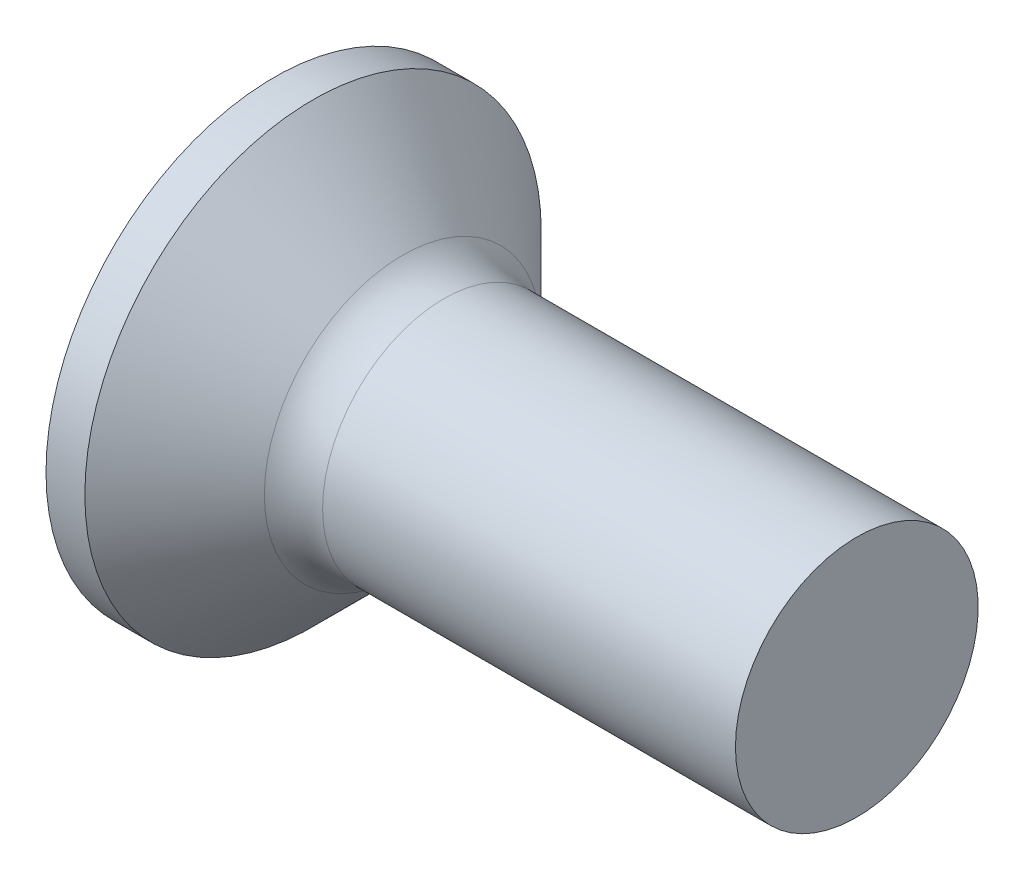
ISO-10303-21;
HEADER;
FILE_DESCRIPTION(('STEP AP214'),'2;1');
FILE_NAME('part.step','',(''),(''),'','','');
FILE_SCHEMA(('AUTOMOTIVE_DESIGN { 1 0 10303 214 1 1 1 1 }'));
ENDSEC;
DATA;
#1=APPLICATION_CONTEXT('core data for automotive mechanical design processes');
#2=APPLICATION_PROTOCOL_DEFINITION('international standard','automotive_design',2000,#1);
#3=PRODUCT_CONTEXT('',#1,'mechanical');
#4=PRODUCT('Part','Part','',(#3));
#5=PRODUCT_RELATED_PRODUCT_CATEGORY('part','',(#4));
#6=PRODUCT_DEFINITION_FORMATION('','',#4);
#7=PRODUCT_DEFINITION_CONTEXT('part definition',#1,'design');
#8=PRODUCT_DEFINITION('design','',#6,#7);
#9=PRODUCT_DEFINITION_SHAPE('','',#8);
#10=(LENGTH_UNIT() NAMED_UNIT(*) SI_UNIT(.MILLI.,.METRE.));
#11=(NAMED_UNIT(*) PLANE_ANGLE_UNIT() SI_UNIT($,.RADIAN.));
#12=(NAMED_UNIT(*) SI_UNIT($,.STERADIAN.) SOLID_ANGLE_UNIT());
#13=UNCERTAINTY_MEASURE_WITH_UNIT(LENGTH_MEASURE(1.E-05),#10,'distance_accuracy_value','');
#14=(GEOMETRIC_REPRESENTATION_CONTEXT(3) GLOBAL_UNCERTAINTY_ASSIGNED_CONTEXT((#13)) GLOBAL_UNIT_ASSIGNED_CONTEXT((#10,
#11,#12)) REPRESENTATION_CONTEXT('',''));
#15=CARTESIAN_POINT('',(0.,0.,0.));
#16=DIRECTION('',(0.,0.,1.));
#17=DIRECTION('',(1.,0.,0.));
#18=AXIS2_PLACEMENT_3D('',#15,#16,#17);
#19=CARTESIAN_POINT('',(1.73,0.370000000000002,-0.537453847829801));
#20=DIRECTION('',(-0.446197800778958,0.,0.89493436774996));
#21=DIRECTION('',(0.89493436774996,0.,0.446197800778958));
#22=AXIS2_PLACEMENT_3D('',#19,#20,#21);
#23=PLANE('',#22);
#24=DIRECTION('',(0.,1.,0.));
#25=VECTOR('',#24,1.);
#26=CARTESIAN_POINT('',(0.,0.370000000000002,-1.4));
#27=LINE('',#26,#25);
#28=CARTESIAN_POINT('',(0.,0.370000000000005,-1.4));
#29=VERTEX_POINT('',#28);
#30=CARTESIAN_POINT('',(0.,-0.369999999999996,-1.4));
#31=VERTEX_POINT('',#30);
#32=EDGE_CURVE('E175',#29,#31,#27,.F.);
#33=ORIENTED_EDGE('',*,*,#32,.T.);
#34=DIRECTION('',(-0.89493436774996,0.,-0.446197800778958));
#35=VECTOR('',#34,1.);
#36=CARTESIAN_POINT('',(1.73,-0.369999999999998,-0.537453847829803));
#37=LINE('',#36,#35);
#38=CARTESIAN_POINT('',(1.73,-0.369999999999997,-0.537453847829803));
#39=VERTEX_POINT('',#38);
#40=EDGE_CURVE('E203',#39,#31,#37,.T.);
#41=ORIENTED_EDGE('',*,*,#40,.F.);
#42=DIRECTION('',(0.,1.,0.));
#43=VECTOR('',#42,1.);
#44=CARTESIAN_POINT('',(1.73,0.370000000000002,-0.537453847829801));
#45=LINE('',#44,#43);
#46=CARTESIAN_POINT('',(1.73,-0.142405622961569,-0.537453847829803));
#47=VERTEX_POINT('',#46);
#48=EDGE_CURVE('E186',#39,#47,#45,.T.);
#49=ORIENTED_EDGE('',*,*,#48,.T.);
#50=CARTESIAN_POINT('',(2.67005364887817,0.,-0.0687604040879396));
#51=DIRECTION('',(-0.446197800778958,0.,0.89493436774996));
#52=DIRECTION('',(-0.89493436774996,0.,-0.446197800778958));
#53=AXIS2_PLACEMENT_3D('',#50,#51,#52);
#54=ELLIPSE('',#53,1.09876168000609,0.485419222295071);
#55=CARTESIAN_POINT('',(1.73,0.142405622961573,-0.537453847829802));
#56=VERTEX_POINT('',#55);
#57=EDGE_CURVE('E20',#47,#56,#54,.F.);
#58=ORIENTED_EDGE('',*,*,#57,.T.);
#59=DIRECTION('',(0.,1.,0.));
#60=VECTOR('',#59,1.);
#61=CARTESIAN_POINT('',(1.73,0.370000000000002,-0.537453847829801));
#62=LINE('',#61,#60);
#63=CARTESIAN_POINT('',(1.73,0.370000000000002,-0.537453847829801));
#64=VERTEX_POINT('',#63);
#65=EDGE_CURVE('E167',#56,#64,#62,.T.);
#66=ORIENTED_EDGE('',*,*,#65,.T.);
#67=DIRECTION('',(0.89493436774996,0.,0.446197800778958));
#68=VECTOR('',#67,1.);
#69=CARTESIAN_POINT('',(0.,0.370000000000005,-1.4));
#70=LINE('',#69,#68);
#71=EDGE_CURVE('E193',#29,#64,#70,.T.);
#72=ORIENTED_EDGE('',*,*,#71,.F.);
#73=EDGE_LOOP('',(#33,#41,#49,#58,#66,#72));
#74=FACE_BOUND('',#73,.T.);
#75=ADVANCED_FACE('F17',(#74),#23,.T.);
#76=CARTESIAN_POINT('',(1.73,-0.369999999999998,-0.537453847829803));
#77=DIRECTION('',(0.,1.,0.));
#78=DIRECTION('',(0.,0.,1.));
#79=AXIS2_PLACEMENT_3D('',#76,#77,#78);
#80=PLANE('',#79);
#81=DIRECTION('',(0.,0.,1.));
#82=VECTOR('',#81,1.);
#83=CARTESIAN_POINT('',(1.73,-0.369999999999998,-0.537453847829803));
#84=LINE('',#83,#82);
#85=CARTESIAN_POINT('',(1.73000000000456,-0.369999999999999,-0.415013252797763));
#86=VERTEX_POINT('',#85);
#87=EDGE_CURVE('E206',#86,#39,#84,.F.);
#88=ORIENTED_EDGE('',*,*,#87,.T.);
#89=ORIENTED_EDGE('',*,*,#40,.T.);
#90=DIRECTION('',(0.,0.,1.));
#91=VECTOR('',#90,1.);
#92=CARTESIAN_POINT('',(0.,-0.369999999999998,-0.537453847829803));
#93=LINE('',#92,#91);
#94=CARTESIAN_POINT('',(0.,-0.369999999999998,-0.566915305441009));
#95=VERTEX_POINT('',#94);
#96=EDGE_CURVE('E200',#31,#95,#93,.T.);
#97=ORIENTED_EDGE('',*,*,#96,.T.);
#98=CARTESIAN_POINT('',(1.15518839060341E-13,-0.369999999999998,-0.566915305441));
#99=CARTESIAN_POINT('',(0.2102117982196,-0.369999999999998,-0.549344413469358));
#100=CARTESIAN_POINT('',(0.420407070773422,-0.369999999999998,-0.531564435256427));
#101=CARTESIAN_POINT('',(0.840738581494577,-0.369999999999998,-0.495346236697712));
#102=CARTESIAN_POINT('',(1.05087482025002,-0.369999999999998,-0.476908023162054));
#103=CARTESIAN_POINT('',(1.33915479954322,-0.369999999999998,-0.45099175681714));
#104=CARTESIAN_POINT('',(1.41733328844347,-0.369999999999999,-0.443900811020496));
#105=CARTESIAN_POINT('',(1.57367713349997,-0.369999999999999,-0.429572412867441));
#106=CARTESIAN_POINT('',(1.65184248960491,-0.369999999999999,-0.422334959951629));
#107=CARTESIAN_POINT('',(1.73000000000269,-0.369999999999999,-0.41501325279576));
#108=B_SPLINE_CURVE_WITH_KNOTS('',3,(#98,#99,#100,#101,#102,#103,#104,#105,#106,#107),
.UNSPECIFIED.,.F.,.F.,(4,2,2,2,4),(0.,0.632836027833726,1.26566551022003,1.5011636151346,
1.73666261941034),.UNSPECIFIED.);
#109=EDGE_CURVE('E444',#95,#86,#108,.T.);
#110=ORIENTED_EDGE('',*,*,#109,.T.);
#111=EDGE_LOOP('',(#88,#89,#97,#110));
#112=FACE_BOUND('',#111,.T.);
#113=ADVANCED_FACE('F462',(#112),#80,.T.);
#114=CARTESIAN_POINT('',(1.73,0.369999999999998,0.537453847829803));
#115=DIRECTION('',(0.,-1.,0.));
#116=DIRECTION('',(0.,0.,-1.));
#117=AXIS2_PLACEMENT_3D('',#114,#115,#116);
#118=PLANE('',#117);
#119=DIRECTION('',(0.,0.,-1.));
#120=VECTOR('',#119,1.);
#121=CARTESIAN_POINT('',(0.,0.369999999999998,0.537453847829803));
#122=LINE('',#121,#120);
#123=CARTESIAN_POINT('',(0.,0.370000000000002,-0.566915305441002));
#124=VERTEX_POINT('',#123);
#125=EDGE_CURVE('E196',#124,#29,#122,.T.);
#126=ORIENTED_EDGE('',*,*,#125,.T.);
#127=ORIENTED_EDGE('',*,*,#71,.T.);
#128=DIRECTION('',(0.,0.,-1.));
#129=VECTOR('',#128,1.);
#130=CARTESIAN_POINT('',(1.73,0.369999999999998,0.537453847829803));
#131=LINE('',#130,#129);
#132=CARTESIAN_POINT('',(1.73000000000456,0.370000000000001,-0.41501325279776));
#133=VERTEX_POINT('',#132);
#134=EDGE_CURVE('E171',#64,#133,#131,.F.);
#135=ORIENTED_EDGE('',*,*,#134,.T.);
#136=CARTESIAN_POINT('',(1.73000000000269,0.370000000000001,-0.415013252795685));
#137=CARTESIAN_POINT('',(1.5575031296645,0.370000000000001,-0.43115840306127));
#138=CARTESIAN_POINT('',(1.384970964837,0.370000000000001,-0.446919624104935));
#139=CARTESIAN_POINT('',(1.03985338162105,0.370000000000002,-0.477835186695482));
#140=CARTESIAN_POINT('',(0.867267963610062,0.370000000000002,-0.492989532448679));
#141=CARTESIAN_POINT('',(0.578901935112579,0.370000000000002,-0.517935214751777));
#142=CARTESIAN_POINT('',(0.463131863682273,0.370000000000002,-0.527849157289397));
#143=CARTESIAN_POINT('',(0.231576539330875,0.370000000000002,-0.547504590054716));
#144=CARTESIAN_POINT('',(0.115791286342449,0.370000000000002,-0.557246079489565));
#145=CARTESIAN_POINT('',(1.17860762946342E-13,0.370000000000002,-0.566915305441023));
#146=B_SPLINE_CURVE_WITH_KNOTS('',3,(#136,#137,#138,#139,#140,#141,#142,#143,#144,#145),
.UNSPECIFIED.,.F.,.F.,(4,2,2,2,4),(0.,0.51975104195004,1.03949848082865,1.38807974305796,
1.73666260746855),.UNSPECIFIED.);
#147=EDGE_CURVE('E441',#133,#124,#146,.T.);
#148=ORIENTED_EDGE('',*,*,#147,.T.);
#149=EDGE_LOOP('',(#126,#127,#135,#148));
#150=FACE_BOUND('',#149,.T.);
#151=ADVANCED_FACE('F483',(#150),#118,.T.);
#152=CARTESIAN_POINT('',(0.,0.,0.));
#153=DIRECTION('',(-1.,0.,0.));
#154=DIRECTION('',(0.,0.,1.));
#155=AXIS2_PLACEMENT_3D('',#152,#153,#154);
#156=CONICAL_SURFACE('',#155,0.676973384663881,0.0698131700826303);
#157=ORIENTED_EDGE('',*,*,#109,.F.);
#158=CARTESIAN_POINT('',(0.,0.,0.));
#159=DIRECTION('',(-1.,0.,0.));
#160=DIRECTION('',(0.,0.,1.));
#161=AXIS2_PLACEMENT_3D('',#158,#159,#160);
#162=CIRCLE('',#161,0.676973384663881);
#163=CARTESIAN_POINT('',(0.,-0.566915305441008,-0.37));
#164=VERTEX_POINT('',#163);
#165=EDGE_CURVE('E195',#164,#95,#162,.F.);
#166=ORIENTED_EDGE('',*,*,#165,.F.);
#167=CARTESIAN_POINT('',(1.73000000000114,-0.415013252795832,-0.37));
#168=CARTESIAN_POINT('',(1.55750312966291,-0.431158403061417,-0.37));
#169=CARTESIAN_POINT('',(1.38497096483538,-0.446919624105083,-0.37));
#170=CARTESIAN_POINT('',(1.03985338161936,-0.477835186695632,-0.37));
#171=CARTESIAN_POINT('',(0.86726796360834,-0.49298953244883,-0.37));
#172=CARTESIAN_POINT('',(0.57890193511112,-0.517935214751904,-0.37));
#173=CARTESIAN_POINT('',(0.463131863681111,-0.527849157289497,-0.37));
#174=CARTESIAN_POINT('',(0.231576539330305,-0.547504590054765,-0.37));
#175=CARTESIAN_POINT('',(0.115791286342175,-0.557246079489589,-0.37));
#176=CARTESIAN_POINT('',(1.4020293900195E-13,-0.566915305441022,-0.37));
#177=B_SPLINE_CURVE_WITH_KNOTS('',3,(#167,#168,#169,#170,#171,#172,#173,#174,#175,#176),
.UNSPECIFIED.,.F.,.F.,(4,2,2,2,4),(0.,0.519751041950141,1.03949848082886,1.38807974305727,
1.73666260746697),.UNSPECIFIED.);
#178=CARTESIAN_POINT('',(1.73000000000456,-0.415013252797762,-0.37));
#179=VERTEX_POINT('',#178);
#180=EDGE_CURVE('E431',#179,#164,#177,.T.);
#181=ORIENTED_EDGE('',*,*,#180,.F.);
#182=CARTESIAN_POINT('',(1.73000000000911,0.,0.));
#183=DIRECTION('',(-1.,0.,0.));
#184=DIRECTION('',(0.,0.,1.));
#185=AXIS2_PLACEMENT_3D('',#182,#183,#184);
#186=CIRCLE('',#185,0.555999999996004);
#187=EDGE_CURVE('E442',#86,#179,#186,.T.);
#188=ORIENTED_EDGE('',*,*,#187,.F.);
#189=EDGE_LOOP('',(#157,#166,#181,#188));
#190=FACE_BOUND('',#189,.T.);
#191=ADVANCED_FACE('F465',(#190),#156,.F.);
#192=CARTESIAN_POINT('',(0.,0.,0.));
#193=DIRECTION('',(-1.,0.,0.));
#194=DIRECTION('',(0.,0.,1.));
#195=AXIS2_PLACEMENT_3D('',#192,#193,#194);
#196=CONICAL_SURFACE('',#195,0.676973384663881,0.0698131700826303);
#197=ORIENTED_EDGE('',*,*,#147,.F.);
#198=CARTESIAN_POINT('',(1.73000000000911,0.,0.));
#199=DIRECTION('',(-1.,0.,0.));
#200=DIRECTION('',(0.,0.,1.));
#201=AXIS2_PLACEMENT_3D('',#198,#199,#200);
#202=CIRCLE('',#201,0.555999999996004);
#203=CARTESIAN_POINT('',(1.73000000000456,0.415013252797762,-0.37));
#204=VERTEX_POINT('',#203);
#205=EDGE_CURVE('E179',#204,#133,#202,.T.);
#206=ORIENTED_EDGE('',*,*,#205,.F.);
#207=CARTESIAN_POINT('',(1.38054906288361E-13,0.566915305440997,-0.37));
#208=CARTESIAN_POINT('',(0.210211798219623,0.549344413469355,-0.37));
#209=CARTESIAN_POINT('',(0.420407070773443,0.531564435256424,-0.37));
#210=CARTESIAN_POINT('',(0.840738581494597,0.495346236697709,-0.37));
#211=CARTESIAN_POINT('',(1.05087482025004,0.476908023162051,-0.37));
#212=CARTESIAN_POINT('',(1.33915479954298,0.450991756817161,-0.37));
#213=CARTESIAN_POINT('',(1.41733328844297,0.443900811020541,-0.37));
#214=CARTESIAN_POINT('',(1.57367713349894,0.429572412867535,-0.37));
#215=CARTESIAN_POINT('',(1.65184248960362,0.422334959951747,-0.37));
#216=CARTESIAN_POINT('',(1.73000000000114,0.415013252795904,-0.37));
#217=B_SPLINE_CURVE_WITH_KNOTS('',3,(#207,#208,#209,#210,#211,#212,#213,#214,#215,#216),
.UNSPECIFIED.,.F.,.F.,(4,2,2,2,4),(0.,0.632836027833724,1.26566551022003,1.5011636151338,
1.73666261940875),.UNSPECIFIED.);
#218=CARTESIAN_POINT('',(0.,0.566915305441003,-0.37));
#219=VERTEX_POINT('',#218);
#220=EDGE_CURVE('E421',#219,#204,#217,.T.);
#221=ORIENTED_EDGE('',*,*,#220,.F.);
#222=CARTESIAN_POINT('',(0.,0.,0.));
#223=DIRECTION('',(-1.,0.,0.));
#224=DIRECTION('',(0.,0.,1.));
#225=AXIS2_PLACEMENT_3D('',#222,#223,#224);
#226=CIRCLE('',#225,0.676973384663881);
#227=EDGE_CURVE('E437',#124,#219,#226,.F.);
#228=ORIENTED_EDGE('',*,*,#227,.F.);
#229=EDGE_LOOP('',(#197,#206,#221,#228));
#230=FACE_BOUND('',#229,.T.);
#231=ADVANCED_FACE('F490',(#230),#196,.F.);
#232=CARTESIAN_POINT('',(1.73,0.537453847829802,-0.37));
#233=DIRECTION('',(0.,0.,1.));
#234=DIRECTION('',(1.,0.,0.));
#235=AXIS2_PLACEMENT_3D('',#232,#233,#234);
#236=PLANE('',#235);
#237=DIRECTION('',(0.,1.,0.));
#238=VECTOR('',#237,1.);
#239=CARTESIAN_POINT('',(0.,0.537453847829802,-0.37));
#240=LINE('',#239,#238);
#241=CARTESIAN_POINT('',(0.,-1.4,-0.37));
#242=VERTEX_POINT('',#241);
#243=EDGE_CURVE('E427',#164,#242,#240,.F.);
#244=ORIENTED_EDGE('',*,*,#243,.T.);
#245=DIRECTION('',(-0.89493436774996,-0.446197800778958,0.));
#246=VECTOR('',#245,1.);
#247=CARTESIAN_POINT('',(1.73,-0.537453847829802,-0.37));
#248=LINE('',#247,#246);
#249=CARTESIAN_POINT('',(1.73,-0.537453847829802,-0.37));
#250=VERTEX_POINT('',#249);
#251=EDGE_CURVE('E408',#250,#242,#248,.T.);
#252=ORIENTED_EDGE('',*,*,#251,.F.);
#253=DIRECTION('',(0.,1.,0.));
#254=VECTOR('',#253,1.);
#255=CARTESIAN_POINT('',(1.73,0.537453847829802,-0.37));
#256=LINE('',#255,#254);
#257=EDGE_CURVE('E434',#250,#179,#256,.T.);
#258=ORIENTED_EDGE('',*,*,#257,.T.);
#259=ORIENTED_EDGE('',*,*,#180,.T.);
#260=EDGE_LOOP('',(#244,#252,#258,#259));
#261=FACE_BOUND('',#260,.T.);
#262=ADVANCED_FACE('F532',(#261),#236,.T.);
#263=CARTESIAN_POINT('',(1.73,0.537453847829802,-0.37));
#264=DIRECTION('',(0.,0.,1.));
#265=DIRECTION('',(1.,0.,0.));
#266=AXIS2_PLACEMENT_3D('',#263,#264,#265);
#267=PLANE('',#266);
#268=DIRECTION('',(0.,1.,0.));
#269=VECTOR('',#268,1.);
#270=CARTESIAN_POINT('',(1.73,0.537453847829802,-0.37));
#271=LINE('',#270,#269);
#272=CARTESIAN_POINT('',(1.73,0.537453847829802,-0.37));
#273=VERTEX_POINT('',#272);
#274=EDGE_CURVE('E413',#204,#273,#271,.T.);
#275=ORIENTED_EDGE('',*,*,#274,.T.);
#276=DIRECTION('',(0.89493436774996,-0.446197800778958,0.));
#277=VECTOR('',#276,1.);
#278=CARTESIAN_POINT('',(1.73,0.537453847829802,-0.37));
#279=LINE('',#278,#277);
#280=CARTESIAN_POINT('',(0.,1.4,-0.37));
#281=VERTEX_POINT('',#280);
#282=EDGE_CURVE('E389',#281,#273,#279,.T.);
#283=ORIENTED_EDGE('',*,*,#282,.F.);
#284=DIRECTION('',(0.,1.,0.));
#285=VECTOR('',#284,1.);
#286=CARTESIAN_POINT('',(0.,0.537453847829802,-0.37));
#287=LINE('',#286,#285);
#288=EDGE_CURVE('E424',#281,#219,#287,.F.);
#289=ORIENTED_EDGE('',*,*,#288,.T.);
#290=ORIENTED_EDGE('',*,*,#220,.T.);
#291=EDGE_LOOP('',(#275,#283,#289,#290));
#292=FACE_BOUND('',#291,.T.);
#293=ADVANCED_FACE('F527',(#292),#267,.T.);
#294=CARTESIAN_POINT('',(1.73,-0.537453847829802,-0.37));
#295=DIRECTION('',(-0.446197800778958,0.89493436774996,0.));
#296=DIRECTION('',(-0.89493436774996,-0.446197800778958,0.));
#297=AXIS2_PLACEMENT_3D('',#294,#295,#296);
#298=PLANE('',#297);
#299=DIRECTION('',(0.,0.,1.));
#300=VECTOR('',#299,1.);
#301=CARTESIAN_POINT('',(0.,-1.4,-0.37));
#302=LINE('',#301,#300);
#303=CARTESIAN_POINT('',(0.,-1.4,0.37));
#304=VERTEX_POINT('',#303);
#305=EDGE_CURVE('E399',#242,#304,#302,.T.);
#306=ORIENTED_EDGE('',*,*,#305,.T.);
#307=DIRECTION('',(-0.89493436774996,-0.446197800778958,0.));
#308=VECTOR('',#307,1.);
#309=CARTESIAN_POINT('',(1.73,-0.537453847829802,0.37));
#310=LINE('',#309,#308);
#311=CARTESIAN_POINT('',(1.73,-0.537453847829802,0.37));
#312=VERTEX_POINT('',#311);
#313=EDGE_CURVE('E349',#312,#304,#310,.T.);
#314=ORIENTED_EDGE('',*,*,#313,.F.);
#315=DIRECTION('',(0.,0.,-1.));
#316=VECTOR('',#315,1.);
#317=CARTESIAN_POINT('',(1.73,-0.537453847829802,-0.37));
#318=LINE('',#317,#316);
#319=CARTESIAN_POINT('',(1.73,-0.537453847829802,0.142405622961571));
#320=VERTEX_POINT('',#319);
#321=EDGE_CURVE('E374',#312,#320,#318,.T.);
#322=ORIENTED_EDGE('',*,*,#321,.T.);
#323=CARTESIAN_POINT('',(2.67005364887817,-0.0687604040879396,0.));
#324=DIRECTION('',(-0.446197800778958,0.89493436774996,0.));
#325=DIRECTION('',(-0.89493436774996,-0.446197800778958,0.));
#326=AXIS2_PLACEMENT_3D('',#323,#324,#325);
#327=ELLIPSE('',#326,1.09876168000609,0.485419222295071);
#328=CARTESIAN_POINT('',(1.73,-0.537453847829802,-0.14240562296157));
#329=VERTEX_POINT('',#328);
#330=EDGE_CURVE('E366',#320,#329,#327,.F.);
#331=ORIENTED_EDGE('',*,*,#330,.T.);
#332=DIRECTION('',(0.,0.,-1.));
#333=VECTOR('',#332,1.);
#334=CARTESIAN_POINT('',(1.73,-0.537453847829802,-0.37));
#335=LINE('',#334,#333);
#336=EDGE_CURVE('E359',#329,#250,#335,.T.);
#337=ORIENTED_EDGE('',*,*,#336,.T.);
#338=ORIENTED_EDGE('',*,*,#251,.T.);
#339=EDGE_LOOP('',(#306,#314,#322,#331,#337,#338));
#340=FACE_BOUND('',#339,.T.);
#341=ADVANCED_FACE('F531',(#340),#298,.T.);
#342=CARTESIAN_POINT('',(1.73,0.537453847829802,0.37));
#343=DIRECTION('',(-0.446197800778958,-0.89493436774996,0.));
#344=DIRECTION('',(0.89493436774996,-0.446197800778958,0.));
#345=AXIS2_PLACEMENT_3D('',#342,#343,#344);
#346=PLANE('',#345);
#347=DIRECTION('',(0.,0.,1.));
#348=VECTOR('',#347,1.);
#349=CARTESIAN_POINT('',(0.,1.4,0.37));
#350=LINE('',#349,#348);
#351=CARTESIAN_POINT('',(0.,1.4,0.37));
#352=VERTEX_POINT('',#351);
#353=EDGE_CURVE('E396',#352,#281,#350,.F.);
#354=ORIENTED_EDGE('',*,*,#353,.T.);
#355=ORIENTED_EDGE('',*,*,#282,.T.);
#356=DIRECTION('',(0.,0.,-1.));
#357=VECTOR('',#356,1.);
#358=CARTESIAN_POINT('',(1.73,0.537453847829802,-0.37));
#359=LINE('',#358,#357);
#360=CARTESIAN_POINT('',(1.73,0.537453847829802,-0.142405622961572));
#361=VERTEX_POINT('',#360);
#362=EDGE_CURVE('E387',#273,#361,#359,.F.);
#363=ORIENTED_EDGE('',*,*,#362,.T.);
#364=CARTESIAN_POINT('',(2.67005364887817,0.06876040408794,0.));
#365=DIRECTION('',(-0.446197800778958,-0.89493436774996,0.));
#366=DIRECTION('',(-0.89493436774996,0.446197800778958,0.));
#367=AXIS2_PLACEMENT_3D('',#364,#365,#366);
#368=ELLIPSE('',#367,1.09876168000609,0.485419222295071);
#369=CARTESIAN_POINT('',(1.73,0.537453847829802,0.142405622961571));
#370=VERTEX_POINT('',#369);
#371=EDGE_CURVE('E380',#361,#370,#368,.F.);
#372=ORIENTED_EDGE('',*,*,#371,.T.);
#373=DIRECTION('',(0.,0.,-1.));
#374=VECTOR('',#373,1.);
#375=CARTESIAN_POINT('',(1.73,0.537453847829802,-0.37));
#376=LINE('',#375,#374);
#377=CARTESIAN_POINT('',(1.73,0.537453847829802,0.37));
#378=VERTEX_POINT('',#377);
#379=EDGE_CURVE('E376',#370,#378,#376,.F.);
#380=ORIENTED_EDGE('',*,*,#379,.T.);
#381=DIRECTION('',(0.89493436774996,-0.446197800778958,0.));
#382=VECTOR('',#381,1.);
#383=CARTESIAN_POINT('',(0.,1.4,0.37));
#384=LINE('',#383,#382);
#385=EDGE_CURVE('E181',#352,#378,#384,.T.);
#386=ORIENTED_EDGE('',*,*,#385,.F.);
#387=EDGE_LOOP('',(#354,#355,#363,#372,#380,#386));
#388=FACE_BOUND('',#387,.T.);
#389=ADVANCED_FACE('F583',(#388),#346,.T.);
#390=CARTESIAN_POINT('',(1.73,0.537453847829802,-0.37));
#391=DIRECTION('',(1.,0.,0.));
#392=DIRECTION('',(0.,0.,-1.));
#393=AXIS2_PLACEMENT_3D('',#390,#391,#392);
#394=PLANE('',#393);
#395=ORIENTED_EDGE('',*,*,#134,.F.);
#396=ORIENTED_EDGE('',*,*,#65,.F.);
#397=CARTESIAN_POINT('',(1.73000000000001,0.,0.));
#398=DIRECTION('',(-1.,0.,0.));
#399=DIRECTION('',(0.,0.,1.));
#400=AXIS2_PLACEMENT_3D('',#397,#398,#399);
#401=CIRCLE('',#400,0.556000000000001);
#402=EDGE_CURVE('E169',#56,#133,#401,.F.);
#403=ORIENTED_EDGE('',*,*,#402,.T.);
#404=EDGE_LOOP('',(#395,#396,#403));
#405=FACE_BOUND('',#404,.T.);
#406=ADVANCED_FACE('F168',(#405),#394,.F.);
#407=CARTESIAN_POINT('',(1.73,0.537453847829802,-0.37));
#408=DIRECTION('',(1.,0.,0.));
#409=DIRECTION('',(0.,0.,-1.));
#410=AXIS2_PLACEMENT_3D('',#407,#408,#409);
#411=PLANE('',#410);
#412=ORIENTED_EDGE('',*,*,#362,.F.);
#413=ORIENTED_EDGE('',*,*,#274,.F.);
#414=CARTESIAN_POINT('',(1.73000000000001,0.,0.));
#415=DIRECTION('',(-1.,0.,0.));
#416=DIRECTION('',(0.,0.,1.));
#417=AXIS2_PLACEMENT_3D('',#414,#415,#416);
#418=CIRCLE('',#417,0.556000000000001);
#419=EDGE_CURVE('E180',#204,#361,#418,.F.);
#420=ORIENTED_EDGE('',*,*,#419,.T.);
#421=EDGE_LOOP('',(#412,#413,#420));
#422=FACE_BOUND('',#421,.T.);
#423=ADVANCED_FACE('F577',(#422),#411,.F.);
#424=CARTESIAN_POINT('',(1.68696045079741,0.,0.));
#425=DIRECTION('',(-1.,0.,0.));
#426=DIRECTION('',(0.,0.,1.));
#427=AXIS2_PLACEMENT_3D('',#424,#425,#426);
#428=CONICAL_SURFACE('',#427,0.559009618463335,0.0698131701600334);
#429=ORIENTED_EDGE('',*,*,#371,.F.);
#430=CARTESIAN_POINT('',(1.73000000000001,0.,0.));
#431=DIRECTION('',(-1.,0.,0.));
#432=DIRECTION('',(0.,0.,1.));
#433=AXIS2_PLACEMENT_3D('',#430,#431,#432);
#434=CIRCLE('',#433,0.556000000000001);
#435=EDGE_CURVE('E383',#361,#370,#434,.F.);
#436=ORIENTED_EDGE('',*,*,#435,.T.);
#437=EDGE_LOOP('',(#429,#436));
#438=FACE_BOUND('',#437,.T.);
#439=ADVANCED_FACE('F573',(#438),#428,.F.);
#440=CARTESIAN_POINT('',(1.73,0.537453847829802,-0.37));
#441=DIRECTION('',(1.,0.,0.));
#442=DIRECTION('',(0.,0.,-1.));
#443=AXIS2_PLACEMENT_3D('',#440,#441,#442);
#444=PLANE('',#443);
#445=DIRECTION('',(0.,1.,0.));
#446=VECTOR('',#445,1.);
#447=CARTESIAN_POINT('',(1.73,-0.537453847829802,0.37));
#448=LINE('',#447,#446);
#449=CARTESIAN_POINT('',(1.73000000000456,0.415013252797762,0.37));
#450=VERTEX_POINT('',#449);
#451=EDGE_CURVE('E344',#378,#450,#448,.F.);
#452=ORIENTED_EDGE('',*,*,#451,.F.);
#453=ORIENTED_EDGE('',*,*,#379,.F.);
#454=CARTESIAN_POINT('',(1.73000000000001,0.,0.));
#455=DIRECTION('',(-1.,0.,0.));
#456=DIRECTION('',(0.,0.,1.));
#457=AXIS2_PLACEMENT_3D('',#454,#455,#456);
#458=CIRCLE('',#457,0.556000000000001);
#459=EDGE_CURVE('E386',#370,#450,#458,.F.);
#460=ORIENTED_EDGE('',*,*,#459,.T.);
#461=EDGE_LOOP('',(#452,#453,#460));
#462=FACE_BOUND('',#461,.T.);
#463=ADVANCED_FACE('F566',(#462),#444,.F.);
#464=CARTESIAN_POINT('',(1.73,0.537453847829802,-0.37));
#465=DIRECTION('',(1.,0.,0.));
#466=DIRECTION('',(0.,0.,-1.));
#467=AXIS2_PLACEMENT_3D('',#464,#465,#466);
#468=PLANE('',#467);
#469=ORIENTED_EDGE('',*,*,#321,.F.);
#470=DIRECTION('',(0.,1.,0.));
#471=VECTOR('',#470,1.);
#472=CARTESIAN_POINT('',(1.73,-0.537453847829802,0.37));
#473=LINE('',#472,#471);
#474=CARTESIAN_POINT('',(1.73000000000456,-0.415013252797762,0.37));
#475=VERTEX_POINT('',#474);
#476=EDGE_CURVE('E352',#475,#312,#473,.F.);
#477=ORIENTED_EDGE('',*,*,#476,.F.);
#478=CARTESIAN_POINT('',(1.73000000000001,0.,0.));
#479=DIRECTION('',(-1.,0.,0.));
#480=DIRECTION('',(0.,0.,1.));
#481=AXIS2_PLACEMENT_3D('',#478,#479,#480);
#482=CIRCLE('',#481,0.556000000000001);
#483=EDGE_CURVE('E373',#475,#320,#482,.F.);
#484=ORIENTED_EDGE('',*,*,#483,.T.);
#485=EDGE_LOOP('',(#469,#477,#484));
#486=FACE_BOUND('',#485,.T.);
#487=ADVANCED_FACE('F559',(#486),#468,.F.);
#488=CARTESIAN_POINT('',(1.68696045079741,0.,0.));
#489=DIRECTION('',(-1.,0.,0.));
#490=DIRECTION('',(0.,0.,1.));
#491=AXIS2_PLACEMENT_3D('',#488,#489,#490);
#492=CONICAL_SURFACE('',#491,0.559009618463335,0.0698131701600334);
#493=ORIENTED_EDGE('',*,*,#330,.F.);
#494=CARTESIAN_POINT('',(1.73000000000001,0.,0.));
#495=DIRECTION('',(-1.,0.,0.));
#496=DIRECTION('',(0.,0.,1.));
#497=AXIS2_PLACEMENT_3D('',#494,#495,#496);
#498=CIRCLE('',#497,0.556000000000001);
#499=EDGE_CURVE('E369',#320,#329,#498,.F.);
#500=ORIENTED_EDGE('',*,*,#499,.T.);
#501=EDGE_LOOP('',(#493,#500));
#502=FACE_BOUND('',#501,.T.);
#503=ADVANCED_FACE('F557',(#502),#492,.F.);
#504=CARTESIAN_POINT('',(1.73,0.537453847829802,-0.37));
#505=DIRECTION('',(1.,0.,0.));
#506=DIRECTION('',(0.,0.,-1.));
#507=AXIS2_PLACEMENT_3D('',#504,#505,#506);
#508=PLANE('',#507);
#509=ORIENTED_EDGE('',*,*,#257,.F.);
#510=ORIENTED_EDGE('',*,*,#336,.F.);
#511=CARTESIAN_POINT('',(1.73000000000001,0.,0.));
#512=DIRECTION('',(-1.,0.,0.));
#513=DIRECTION('',(0.,0.,1.));
#514=AXIS2_PLACEMENT_3D('',#511,#512,#513);
#515=CIRCLE('',#514,0.556000000000001);
#516=EDGE_CURVE('E372',#329,#179,#515,.F.);
#517=ORIENTED_EDGE('',*,*,#516,.T.);
#518=EDGE_LOOP('',(#509,#510,#517));
#519=FACE_BOUND('',#518,.T.);
#520=ADVANCED_FACE('F552',(#519),#508,.F.);
#521=CARTESIAN_POINT('',(1.73,0.537453847829802,-0.37));
#522=DIRECTION('',(1.,0.,0.));
#523=DIRECTION('',(0.,0.,-1.));
#524=AXIS2_PLACEMENT_3D('',#521,#522,#523);
#525=PLANE('',#524);
#526=ORIENTED_EDGE('',*,*,#48,.F.);
#527=ORIENTED_EDGE('',*,*,#87,.F.);
#528=CARTESIAN_POINT('',(1.73000000000001,0.,0.));
#529=DIRECTION('',(-1.,0.,0.));
#530=DIRECTION('',(0.,0.,1.));
#531=AXIS2_PLACEMENT_3D('',#528,#529,#530);
#532=CIRCLE('',#531,0.556000000000001);
#533=EDGE_CURVE('E162',#86,#47,#532,.F.);
#534=ORIENTED_EDGE('',*,*,#533,.T.);
#535=EDGE_LOOP('',(#526,#527,#534));
#536=FACE_BOUND('',#535,.T.);
#537=ADVANCED_FACE('F498',(#536),#525,.F.);
#538=CARTESIAN_POINT('',(1.68696045079741,0.,0.));
#539=DIRECTION('',(-1.,0.,0.));
#540=DIRECTION('',(0.,0.,1.));
#541=AXIS2_PLACEMENT_3D('',#538,#539,#540);
#542=CONICAL_SURFACE('',#541,0.559009618463335,0.0698131701600334);
#543=ORIENTED_EDGE('',*,*,#57,.F.);
#544=CARTESIAN_POINT('',(1.73000000000001,0.,0.));
#545=DIRECTION('',(-1.,0.,0.));
#546=DIRECTION('',(0.,0.,1.));
#547=AXIS2_PLACEMENT_3D('',#544,#545,#546);
#548=CIRCLE('',#547,0.556000000000001);
#549=EDGE_CURVE('E154',#47,#56,#548,.F.);
#550=ORIENTED_EDGE('',*,*,#549,.T.);
#551=EDGE_LOOP('',(#543,#550));
#552=FACE_BOUND('',#551,.T.);
#553=ADVANCED_FACE('F156',(#552),#542,.F.);
#554=CARTESIAN_POINT('',(1.73,-0.537453847829802,0.37));
#555=DIRECTION('',(0.,0.,-1.));
#556=DIRECTION('',(0.,1.,0.));
#557=AXIS2_PLACEMENT_3D('',#554,#555,#556);
#558=PLANE('',#557);
#559=ORIENTED_EDGE('',*,*,#476,.T.);
#560=ORIENTED_EDGE('',*,*,#313,.T.);
#561=DIRECTION('',(0.,1.,0.));
#562=VECTOR('',#561,1.);
#563=CARTESIAN_POINT('',(0.,-0.537453847829802,0.37));
#564=LINE('',#563,#562);
#565=CARTESIAN_POINT('',(0.,-0.566915305441008,0.37));
#566=VERTEX_POINT('',#565);
#567=EDGE_CURVE('E355',#304,#566,#564,.T.);
#568=ORIENTED_EDGE('',*,*,#567,.T.);
#569=CARTESIAN_POINT('',(1.15517641289877E-13,-0.566915305440998,0.37));
#570=CARTESIAN_POINT('',(0.2102117982196,-0.549344413469357,0.37));
#571=CARTESIAN_POINT('',(0.420407070773422,-0.531564435256425,0.37));
#572=CARTESIAN_POINT('',(0.840738581494577,-0.495346236697711,0.37));
#573=CARTESIAN_POINT('',(1.05087482025002,-0.476908023162053,0.37));
#574=CARTESIAN_POINT('',(1.33915479954322,-0.450991756817138,0.37));
#575=CARTESIAN_POINT('',(1.41733328844347,-0.443900811020495,0.37));
#576=CARTESIAN_POINT('',(1.57367713349997,-0.42957241286744,0.37));
#577=CARTESIAN_POINT('',(1.65184248960491,-0.422334959951627,0.37));
#578=CARTESIAN_POINT('',(1.73000000000269,-0.415013252795759,0.37));
#579=B_SPLINE_CURVE_WITH_KNOTS('',3,(#569,#570,#571,#572,#573,#574,#575,#576,#577,#578),
.UNSPECIFIED.,.F.,.F.,(4,2,2,2,4),(0.,0.632836027833726,1.26566551022003,1.5011636151346,
1.73666261941034),.UNSPECIFIED.);
#580=EDGE_CURVE('E161',#566,#475,#579,.T.);
#581=ORIENTED_EDGE('',*,*,#580,.T.);
#582=EDGE_LOOP('',(#559,#560,#568,#581));
#583=FACE_BOUND('',#582,.T.);
#584=ADVANCED_FACE('F616',(#583),#558,.T.);
#585=CARTESIAN_POINT('',(1.73,-0.537453847829802,0.37));
#586=DIRECTION('',(0.,0.,-1.));
#587=DIRECTION('',(0.,1.,0.));
#588=AXIS2_PLACEMENT_3D('',#585,#586,#587);
#589=PLANE('',#588);
#590=DIRECTION('',(0.,1.,0.));
#591=VECTOR('',#590,1.);
#592=CARTESIAN_POINT('',(0.,-0.537453847829802,0.37));
#593=LINE('',#592,#591);
#594=CARTESIAN_POINT('',(0.,0.566915305441003,0.37));
#595=VERTEX_POINT('',#594);
#596=EDGE_CURVE('E341',#595,#352,#593,.T.);
#597=ORIENTED_EDGE('',*,*,#596,.T.);
#598=ORIENTED_EDGE('',*,*,#385,.T.);
#599=ORIENTED_EDGE('',*,*,#451,.T.);
#600=CARTESIAN_POINT('',(1.73000000000269,0.415013252795686,0.37));
#601=CARTESIAN_POINT('',(1.5575031296645,0.431158403061271,0.37));
#602=CARTESIAN_POINT('',(1.384970964837,0.446919624104936,0.37));
#603=CARTESIAN_POINT('',(1.03985338162105,0.477835186695483,0.37));
#604=CARTESIAN_POINT('',(0.867267963610062,0.49298953244868,0.37));
#605=CARTESIAN_POINT('',(0.578901935112579,0.517935214751779,0.37));
#606=CARTESIAN_POINT('',(0.463131863682273,0.527849157289398,0.37));
#607=CARTESIAN_POINT('',(0.231576539330875,0.547504590054717,0.37));
#608=CARTESIAN_POINT('',(0.115791286342449,0.557246079489566,0.37));
#609=CARTESIAN_POINT('',(1.17741803162083E-13,0.566915305441024,0.37));
#610=B_SPLINE_CURVE_WITH_KNOTS('',3,(#600,#601,#602,#603,#604,#605,#606,#607,#608,#609),
.UNSPECIFIED.,.F.,.F.,(4,2,2,2,4),(0.,0.51975104195004,1.03949848082865,1.38807974305796,
1.73666260746855),.UNSPECIFIED.);
#611=EDGE_CURVE('E602',#450,#595,#610,.T.);
#612=ORIENTED_EDGE('',*,*,#611,.T.);
#613=EDGE_LOOP('',(#597,#598,#599,#612));
#614=FACE_BOUND('',#613,.T.);
#615=ADVANCED_FACE('F600',(#614),#589,.T.);
#616=CARTESIAN_POINT('',(1.73000000000001,0.,0.));
#617=DIRECTION('',(-1.,0.,0.));
#618=DIRECTION('',(0.,0.,1.));
#619=AXIS2_PLACEMENT_3D('',#616,#617,#618);
#620=CONICAL_SURFACE('',#619,0.556000000000001,1.25663706143456);
#621=CARTESIAN_POINT('',(1.91065535110552,0.,6.66133814775094E-13));
#622=VERTEX_POINT('',#621);
#623=VERTEX_LOOP('',#622);
#624=FACE_BOUND('',#623,.T.);
#625=ORIENTED_EDGE('',*,*,#402,.F.);
#626=ORIENTED_EDGE('',*,*,#549,.F.);
#627=ORIENTED_EDGE('',*,*,#533,.F.);
#628=ORIENTED_EDGE('',*,*,#187,.T.);
#629=ORIENTED_EDGE('',*,*,#516,.F.);
#630=ORIENTED_EDGE('',*,*,#499,.F.);
#631=ORIENTED_EDGE('',*,*,#483,.F.);
#632=CARTESIAN_POINT('',(1.73000000000911,0.,0.));
#633=DIRECTION('',(-1.,0.,0.));
#634=DIRECTION('',(0.,0.,1.));
#635=AXIS2_PLACEMENT_3D('',#632,#633,#634);
#636=CIRCLE('',#635,0.555999999996004);
#637=CARTESIAN_POINT('',(1.73000000000456,-0.370000000000001,0.41501325279776));
#638=VERTEX_POINT('',#637);
#639=EDGE_CURVE('E338',#475,#638,#636,.T.);
#640=ORIENTED_EDGE('',*,*,#639,.T.);
#641=CARTESIAN_POINT('',(1.73000000000001,0.,0.));
#642=DIRECTION('',(-1.,0.,0.));
#643=DIRECTION('',(0.,0.,1.));
#644=AXIS2_PLACEMENT_3D('',#641,#642,#643);
#645=CIRCLE('',#644,0.556000000000001);
#646=CARTESIAN_POINT('',(1.73000000000456,-0.14240562296033,0.537453847829801));
#647=VERTEX_POINT('',#646);
#648=EDGE_CURVE('E314',#638,#647,#645,.T.);
#649=ORIENTED_EDGE('',*,*,#648,.T.);
#650=CARTESIAN_POINT('',(1.73000000000911,0.,0.));
#651=DIRECTION('',(-1.,0.,0.));
#652=DIRECTION('',(0.,0.,1.));
#653=AXIS2_PLACEMENT_3D('',#650,#651,#652);
#654=CIRCLE('',#653,0.555999999996004);
#655=CARTESIAN_POINT('',(1.73000000000456,0.142405622960325,0.537453847829802));
#656=VERTEX_POINT('',#655);
#657=EDGE_CURVE('E322',#647,#656,#654,.T.);
#658=ORIENTED_EDGE('',*,*,#657,.T.);
#659=CARTESIAN_POINT('',(1.73000000000001,0.,0.));
#660=DIRECTION('',(-1.,0.,0.));
#661=DIRECTION('',(0.,0.,1.));
#662=AXIS2_PLACEMENT_3D('',#659,#660,#661);
#663=CIRCLE('',#662,0.556000000000001);
#664=CARTESIAN_POINT('',(1.73000000000456,0.369999999999999,0.415013252797763));
#665=VERTEX_POINT('',#664);
#666=EDGE_CURVE('E324',#656,#665,#663,.T.);
#667=ORIENTED_EDGE('',*,*,#666,.T.);
#668=CARTESIAN_POINT('',(1.73000000000911,0.,0.));
#669=DIRECTION('',(-1.,0.,0.));
#670=DIRECTION('',(0.,0.,1.));
#671=AXIS2_PLACEMENT_3D('',#668,#669,#670);
#672=CIRCLE('',#671,0.555999999996004);
#673=EDGE_CURVE('E331',#665,#450,#672,.T.);
#674=ORIENTED_EDGE('',*,*,#673,.T.);
#675=ORIENTED_EDGE('',*,*,#459,.F.);
#676=ORIENTED_EDGE('',*,*,#435,.F.);
#677=ORIENTED_EDGE('',*,*,#419,.F.);
#678=ORIENTED_EDGE('',*,*,#205,.T.);
#679=EDGE_LOOP('',(#625,#626,#627,#628,#629,#630,#631,#640,#649,#658,#667,#674,#675,#676,#677,#678));
#680=FACE_BOUND('',#679,.T.);
#681=ADVANCED_FACE('F177',(#624,#680),#620,.F.);
#682=CARTESIAN_POINT('',(0.,0.,0.));
#683=DIRECTION('',(-1.,0.,0.));
#684=DIRECTION('',(0.,0.,1.));
#685=AXIS2_PLACEMENT_3D('',#682,#683,#684);
#686=CONICAL_SURFACE('',#685,0.676973384663881,0.0698131700826303);
#687=CARTESIAN_POINT('',(1.73000000000114,-0.370000000000001,0.41501325279583));
#688=CARTESIAN_POINT('',(1.55750312966291,-0.370000000000001,0.431158403061415));
#689=CARTESIAN_POINT('',(1.38497096483538,-0.370000000000002,0.446919624105082));
#690=CARTESIAN_POINT('',(1.03985338161936,-0.370000000000002,0.477835186695631));
#691=CARTESIAN_POINT('',(0.867267963608341,-0.370000000000002,0.492989532448829));
#692=CARTESIAN_POINT('',(0.57890193511112,-0.370000000000002,0.517935214751903));
#693=CARTESIAN_POINT('',(0.463131863681111,-0.370000000000002,0.527849157289496));
#694=CARTESIAN_POINT('',(0.231576539330305,-0.370000000000002,0.547504590054763));
#695=CARTESIAN_POINT('',(0.115791286342175,-0.370000000000002,0.557246079489588));
#696=CARTESIAN_POINT('',(1.40203012217128E-13,-0.370000000000002,0.566915305441021));
#697=B_SPLINE_CURVE_WITH_KNOTS('',3,(#687,#688,#689,#690,#691,#692,#693,#694,#695,#696),
.UNSPECIFIED.,.F.,.F.,(4,2,2,2,4),(0.,0.519751041950141,1.03949848082886,1.38807974305727,
1.73666260746697),.UNSPECIFIED.);
#698=CARTESIAN_POINT('',(0.,-0.370000000000002,0.566915305441007));
#699=VERTEX_POINT('',#698);
#700=EDGE_CURVE('E231',#638,#699,#697,.T.);
#701=ORIENTED_EDGE('',*,*,#700,.F.);
#702=ORIENTED_EDGE('',*,*,#639,.F.);
#703=ORIENTED_EDGE('',*,*,#580,.F.);
#704=CARTESIAN_POINT('',(0.,0.,0.));
#705=DIRECTION('',(-1.,0.,0.));
#706=DIRECTION('',(0.,0.,1.));
#707=AXIS2_PLACEMENT_3D('',#704,#705,#706);
#708=CIRCLE('',#707,0.676973384663881);
#709=EDGE_CURVE('E340',#699,#566,#708,.F.);
#710=ORIENTED_EDGE('',*,*,#709,.F.);
#711=EDGE_LOOP('',(#701,#702,#703,#710));
#712=FACE_BOUND('',#711,.T.);
#713=ADVANCED_FACE('F267',(#712),#686,.F.);
#714=CARTESIAN_POINT('',(0.,0.,0.));
#715=DIRECTION('',(-1.,0.,0.));
#716=DIRECTION('',(0.,0.,1.));
#717=AXIS2_PLACEMENT_3D('',#714,#715,#716);
#718=CONICAL_SURFACE('',#717,0.676973384663881,0.0698131700826303);
#719=CARTESIAN_POINT('',(1.38054605589258E-13,0.369999999999998,0.566915305440998));
#720=CARTESIAN_POINT('',(0.210211798219623,0.369999999999998,0.549344413469356));
#721=CARTESIAN_POINT('',(0.420407070773443,0.369999999999998,0.531564435256425));
#722=CARTESIAN_POINT('',(0.840738581494597,0.369999999999998,0.49534623669771));
#723=CARTESIAN_POINT('',(1.05087482025004,0.369999999999998,0.476908023162053));
#724=CARTESIAN_POINT('',(1.33915479954298,0.369999999999998,0.450991756817162));
#725=CARTESIAN_POINT('',(1.41733328844297,0.369999999999998,0.443900811020542));
#726=CARTESIAN_POINT('',(1.57367713349894,0.369999999999998,0.429572412867536));
#727=CARTESIAN_POINT('',(1.65184248960362,0.369999999999998,0.422334959951748));
#728=CARTESIAN_POINT('',(1.73000000000114,0.369999999999999,0.415013252795906));
#729=B_SPLINE_CURVE_WITH_KNOTS('',3,(#719,#720,#721,#722,#723,#724,#725,#726,#727,#728),
.UNSPECIFIED.,.F.,.F.,(4,2,2,2,4),(0.,0.632836027833724,1.26566551022003,1.5011636151338,
1.73666261940875),.UNSPECIFIED.);
#730=CARTESIAN_POINT('',(0.,0.369999999999998,0.566915305441004));
#731=VERTEX_POINT('',#730);
#732=EDGE_CURVE('E222',#731,#665,#729,.T.);
#733=ORIENTED_EDGE('',*,*,#732,.F.);
#734=CARTESIAN_POINT('',(0.,0.,0.));
#735=DIRECTION('',(-1.,0.,0.));
#736=DIRECTION('',(0.,0.,1.));
#737=AXIS2_PLACEMENT_3D('',#734,#735,#736);
#738=CIRCLE('',#737,0.676973384663881);
#739=EDGE_CURVE('E334',#595,#731,#738,.F.);
#740=ORIENTED_EDGE('',*,*,#739,.F.);
#741=ORIENTED_EDGE('',*,*,#611,.F.);
#742=ORIENTED_EDGE('',*,*,#673,.F.);
#743=EDGE_LOOP('',(#733,#740,#741,#742));
#744=FACE_BOUND('',#743,.T.);
#745=ADVANCED_FACE('F238',(#744),#718,.F.);
#746=CARTESIAN_POINT('',(1.73,0.537453847829802,-0.37));
#747=DIRECTION('',(1.,0.,0.));
#748=DIRECTION('',(0.,0.,-1.));
#749=AXIS2_PLACEMENT_3D('',#746,#747,#748);
#750=PLANE('',#749);
#751=DIRECTION('',(0.,1.,0.));
#752=VECTOR('',#751,1.);
#753=CARTESIAN_POINT('',(1.73,-0.370000000000002,0.537453847829801));
#754=LINE('',#753,#752);
#755=CARTESIAN_POINT('',(1.73,0.369999999999996,0.537453847829803));
#756=VERTEX_POINT('',#755);
#757=EDGE_CURVE('E221',#756,#656,#754,.F.);
#758=ORIENTED_EDGE('',*,*,#757,.F.);
#759=DIRECTION('',(0.,0.,-1.));
#760=VECTOR('',#759,1.);
#761=CARTESIAN_POINT('',(1.73,0.369999999999998,0.537453847829803));
#762=LINE('',#761,#760);
#763=EDGE_CURVE('E230',#665,#756,#762,.F.);
#764=ORIENTED_EDGE('',*,*,#763,.F.);
#765=ORIENTED_EDGE('',*,*,#666,.F.);
#766=EDGE_LOOP('',(#758,#764,#765));
#767=FACE_BOUND('',#766,.T.);
#768=ADVANCED_FACE('F259',(#767),#750,.F.);
#769=CARTESIAN_POINT('',(1.68647446383829,0.,0.));
#770=DIRECTION('',(-1.,0.,0.));
#771=DIRECTION('',(0.,-1.,0.));
#772=AXIS2_PLACEMENT_3D('',#769,#770,#771);
#773=CONICAL_SURFACE('',#772,0.559043601981557,0.0698131701482616);
#774=ORIENTED_EDGE('',*,*,#657,.F.);
#775=CARTESIAN_POINT('',(2.67005364889878,0.,0.0687604040776653));
#776=DIRECTION('',(-0.446197800778958,0.,-0.89493436774996));
#777=DIRECTION('',(-0.89493436774996,0.,0.446197800778958));
#778=AXIS2_PLACEMENT_3D('',#775,#776,#777);
#779=ELLIPSE('',#778,1.09876168002778,0.485419222306302);
#780=EDGE_CURVE('E217',#656,#647,#779,.F.);
#781=ORIENTED_EDGE('',*,*,#780,.F.);
#782=EDGE_LOOP('',(#774,#781));
#783=FACE_BOUND('',#782,.T.);
#784=ADVANCED_FACE('F256',(#783),#773,.F.);
#785=CARTESIAN_POINT('',(1.73,0.537453847829802,-0.37));
#786=DIRECTION('',(1.,0.,0.));
#787=DIRECTION('',(0.,0.,-1.));
#788=AXIS2_PLACEMENT_3D('',#785,#786,#787);
#789=PLANE('',#788);
#790=DIRECTION('',(0.,0.,1.));
#791=VECTOR('',#790,1.);
#792=CARTESIAN_POINT('',(1.73,-0.369999999999998,-0.537453847829803));
#793=LINE('',#792,#791);
#794=CARTESIAN_POINT('',(1.73,-0.370000000000002,0.537453847829801));
#795=VERTEX_POINT('',#794);
#796=EDGE_CURVE('E311',#795,#638,#793,.F.);
#797=ORIENTED_EDGE('',*,*,#796,.F.);
#798=DIRECTION('',(0.,1.,0.));
#799=VECTOR('',#798,1.);
#800=CARTESIAN_POINT('',(1.73,-0.370000000000002,0.537453847829801));
#801=LINE('',#800,#799);
#802=EDGE_CURVE('E220',#647,#795,#801,.F.);
#803=ORIENTED_EDGE('',*,*,#802,.F.);
#804=ORIENTED_EDGE('',*,*,#648,.F.);
#805=EDGE_LOOP('',(#797,#803,#804));
#806=FACE_BOUND('',#805,.T.);
#807=ADVANCED_FACE('F252',(#806),#789,.F.);
#808=CARTESIAN_POINT('',(1.73,-0.369999999999998,-0.537453847829803));
#809=DIRECTION('',(0.,1.,0.));
#810=DIRECTION('',(0.,0.,1.));
#811=AXIS2_PLACEMENT_3D('',#808,#809,#810);
#812=PLANE('',#811);
#813=DIRECTION('',(0.,0.,1.));
#814=VECTOR('',#813,1.);
#815=CARTESIAN_POINT('',(0.,-0.369999999999998,-0.537453847829803));
#816=LINE('',#815,#814);
#817=CARTESIAN_POINT('',(0.,-0.370000000000004,1.4));
#818=VERTEX_POINT('',#817);
#819=EDGE_CURVE('E305',#699,#818,#816,.T.);
#820=ORIENTED_EDGE('',*,*,#819,.T.);
#821=DIRECTION('',(-0.89493436774996,0.,0.446197800778958));
#822=VECTOR('',#821,1.);
#823=CARTESIAN_POINT('',(1.73,-0.370000000000002,0.537453847829801));
#824=LINE('',#823,#822);
#825=EDGE_CURVE('E293',#795,#818,#824,.T.);
#826=ORIENTED_EDGE('',*,*,#825,.F.);
#827=ORIENTED_EDGE('',*,*,#796,.T.);
#828=ORIENTED_EDGE('',*,*,#700,.T.);
#829=EDGE_LOOP('',(#820,#826,#827,#828));
#830=FACE_BOUND('',#829,.T.);
#831=ADVANCED_FACE('F246',(#830),#812,.T.);
#832=CARTESIAN_POINT('',(1.73,0.369999999999998,0.537453847829803));
#833=DIRECTION('',(0.,-1.,0.));
#834=DIRECTION('',(0.,0.,-1.));
#835=AXIS2_PLACEMENT_3D('',#832,#833,#834);
#836=PLANE('',#835);
#837=ORIENTED_EDGE('',*,*,#763,.T.);
#838=DIRECTION('',(-0.89493436774996,0.,0.446197800778958));
#839=VECTOR('',#838,1.);
#840=CARTESIAN_POINT('',(1.73,0.369999999999995,0.537453847829803));
#841=LINE('',#840,#839);
#842=CARTESIAN_POINT('',(0.,0.369999999999995,1.4));
#843=VERTEX_POINT('',#842);
#844=EDGE_CURVE('E319',#843,#756,#841,.F.);
#845=ORIENTED_EDGE('',*,*,#844,.F.);
#846=DIRECTION('',(0.,0.,-1.));
#847=VECTOR('',#846,1.);
#848=CARTESIAN_POINT('',(0.,0.369999999999998,0.537453847829803));
#849=LINE('',#848,#847);
#850=EDGE_CURVE('E35',#843,#731,#849,.T.);
#851=ORIENTED_EDGE('',*,*,#850,.T.);
#852=ORIENTED_EDGE('',*,*,#732,.T.);
#853=EDGE_LOOP('',(#837,#845,#851,#852));
#854=FACE_BOUND('',#853,.T.);
#855=ADVANCED_FACE('F241',(#854),#836,.T.);
#856=CARTESIAN_POINT('',(1.73,-0.370000000000002,0.537453847829801));
#857=DIRECTION('',(-0.446197800778958,0.,-0.89493436774996));
#858=DIRECTION('',(-0.89493436774996,0.,0.446197800778958));
#859=AXIS2_PLACEMENT_3D('',#856,#857,#858);
#860=PLANE('',#859);
#861=DIRECTION('',(0.,1.,0.));
#862=VECTOR('',#861,1.);
#863=CARTESIAN_POINT('',(0.,0.,1.4));
#864=LINE('',#863,#862);
#865=EDGE_CURVE('E216',#843,#818,#864,.F.);
#866=ORIENTED_EDGE('',*,*,#865,.F.);
#867=ORIENTED_EDGE('',*,*,#844,.T.);
#868=ORIENTED_EDGE('',*,*,#757,.T.);
#869=ORIENTED_EDGE('',*,*,#780,.T.);
#870=ORIENTED_EDGE('',*,*,#802,.T.);
#871=ORIENTED_EDGE('',*,*,#825,.T.);
#872=EDGE_LOOP('',(#866,#867,#868,#869,#870,#871));
#873=FACE_BOUND('',#872,.T.);
#874=ADVANCED_FACE('F245',(#873),#860,.T.);
#875=CARTESIAN_POINT('',(0.,0.,0.));
#876=DIRECTION('',(-1.,0.,0.));
#877=DIRECTION('',(0.,0.,1.));
#878=AXIS2_PLACEMENT_3D('',#875,#876,#877);
#879=PLANE('',#878);
#880=ORIENTED_EDGE('',*,*,#850,.F.);
#881=ORIENTED_EDGE('',*,*,#865,.T.);
#882=ORIENTED_EDGE('',*,*,#819,.F.);
#883=ORIENTED_EDGE('',*,*,#709,.T.);
#884=ORIENTED_EDGE('',*,*,#567,.F.);
#885=ORIENTED_EDGE('',*,*,#305,.F.);
#886=ORIENTED_EDGE('',*,*,#243,.F.);
#887=ORIENTED_EDGE('',*,*,#165,.T.);
#888=ORIENTED_EDGE('',*,*,#96,.F.);
#889=ORIENTED_EDGE('',*,*,#32,.F.);
#890=ORIENTED_EDGE('',*,*,#125,.F.);
#891=ORIENTED_EDGE('',*,*,#227,.T.);
#892=ORIENTED_EDGE('',*,*,#288,.F.);
#893=ORIENTED_EDGE('',*,*,#353,.F.);
#894=ORIENTED_EDGE('',*,*,#596,.F.);
#895=ORIENTED_EDGE('',*,*,#739,.T.);
#896=EDGE_LOOP('',(#880,#881,#882,#883,#884,#885,#886,#887,#888,#889,#890,#891,#892,#893,#894,#895));
#897=FACE_BOUND('',#896,.T.);
#898=CARTESIAN_POINT('',(0.,0.,0.));
#899=DIRECTION('',(-1.,0.,0.));
#900=DIRECTION('',(0.,0.,1.));
#901=AXIS2_PLACEMENT_3D('',#898,#899,#900);
#902=CIRCLE('',#901,2.35);
#903=CARTESIAN_POINT('',(0.,0.,2.35));
#904=VERTEX_POINT('',#903);
#905=EDGE_CURVE('E212',#904,#904,#902,.F.);
#906=ORIENTED_EDGE('',*,*,#905,.F.);
#907=EDGE_LOOP('',(#906));
#908=FACE_BOUND('',#907,.T.);
#909=ADVANCED_FACE('F494',(#897,#908),#879,.T.);
#910=CARTESIAN_POINT('',(-6.34999999999999,0.,0.));
#911=DIRECTION('',(-1.,0.,0.));
#912=DIRECTION('',(0.,0.,1.));
#913=AXIS2_PLACEMENT_3D('',#910,#911,#912);
#914=CYLINDRICAL_SURFACE('',#913,2.35);
#915=ORIENTED_EDGE('',*,*,#905,.T.);
#916=EDGE_LOOP('',(#915));
#917=FACE_BOUND('',#916,.T.);
#918=CARTESIAN_POINT('',(0.399999999956435,0.,0.));
#919=DIRECTION('',(-1.,0.,0.));
#920=DIRECTION('',(0.,0.,1.));
#921=AXIS2_PLACEMENT_3D('',#918,#919,#920);
#922=CIRCLE('',#921,2.35000000003538);
#923=CARTESIAN_POINT('',(0.399999999956435,0.,2.35000000003538));
#924=VERTEX_POINT('',#923);
#925=EDGE_CURVE('E215',#924,#924,#922,.F.);
#926=ORIENTED_EDGE('',*,*,#925,.F.);
#927=EDGE_LOOP('',(#926));
#928=FACE_BOUND('',#927,.T.);
#929=ADVANCED_FACE('F705',(#917,#928),#914,.T.);
#930=CARTESIAN_POINT('',(0.399999999956435,0.,0.));
#931=DIRECTION('',(-1.,0.,0.));
#932=DIRECTION('',(0.,0.,1.));
#933=AXIS2_PLACEMENT_3D('',#930,#931,#932);
#934=CONICAL_SURFACE('',#933,2.35000000003538,0.785398163397448);
#935=ORIENTED_EDGE('',*,*,#925,.T.);
#936=EDGE_LOOP('',(#935));
#937=FACE_BOUND('',#936,.T.);
#938=CARTESIAN_POINT('',(1.32426406871193,0.,0.));
#939=DIRECTION('',(-1.,0.,0.));
#940=DIRECTION('',(0.,0.,1.));
#941=AXIS2_PLACEMENT_3D('',#938,#939,#940);
#942=CIRCLE('',#941,1.42573593128807);
#943=CARTESIAN_POINT('',(1.32426406871193,0.,1.42573593128807));
#944=VERTEX_POINT('',#943);
#945=EDGE_CURVE('E211',#944,#944,#942,.T.);
#946=ORIENTED_EDGE('',*,*,#945,.T.);
#947=EDGE_LOOP('',(#946));
#948=FACE_BOUND('',#947,.T.);
#949=ADVANCED_FACE('F713',(#937,#948),#934,.T.);
#950=CARTESIAN_POINT('',(6.,1.25,0.));
#951=DIRECTION('',(1.,0.,0.));
#952=DIRECTION('',(0.,0.,-1.));
#953=AXIS2_PLACEMENT_3D('',#950,#951,#952);
#954=PLANE('',#953);
#955=CARTESIAN_POINT('',(6.,0.,0.));
#956=DIRECTION('',(-1.,0.,0.));
#957=DIRECTION('',(0.,0.,1.));
#958=AXIS2_PLACEMENT_3D('',#955,#956,#957);
#959=CIRCLE('',#958,1.25);
#960=CARTESIAN_POINT('',(6.,0.,1.25));
#961=VERTEX_POINT('',#960);
#962=EDGE_CURVE('E26',#961,#961,#959,.T.);
#963=ORIENTED_EDGE('',*,*,#962,.F.);
#964=EDGE_LOOP('',(#963));
#965=FACE_BOUND('',#964,.T.);
#966=ADVANCED_FACE('F278',(#965),#954,.T.);
#967=CARTESIAN_POINT('',(1.74852813742386,0.,0.));
#968=DIRECTION('',(-1.,0.,0.));
#969=DIRECTION('',(0.,0.,1.));
#970=AXIS2_PLACEMENT_3D('',#967,#968,#969);
#971=TOROIDAL_SURFACE('',#970,1.85,0.6);
#972=ORIENTED_EDGE('',*,*,#945,.F.);
#973=EDGE_LOOP('',(#972));
#974=FACE_BOUND('',#973,.T.);
#975=CARTESIAN_POINT('',(1.74852813742386,0.,0.));
#976=DIRECTION('',(-1.,0.,0.));
#977=DIRECTION('',(0.,0.,1.));
#978=AXIS2_PLACEMENT_3D('',#975,#976,#977);
#979=CIRCLE('',#978,1.25);
#980=CARTESIAN_POINT('',(1.74852813742386,0.,1.25));
#981=VERTEX_POINT('',#980);
#982=EDGE_CURVE('E11',#981,#981,#979,.F.);
#983=ORIENTED_EDGE('',*,*,#982,.F.);
#984=EDGE_LOOP('',(#983));
#985=FACE_BOUND('',#984,.T.);
#986=ADVANCED_FACE('F272',(#974,#985),#971,.F.);
#987=CARTESIAN_POINT('',(-6.34999999999999,0.,0.));
#988=DIRECTION('',(-1.,0.,0.));
#989=DIRECTION('',(0.,0.,1.));
#990=AXIS2_PLACEMENT_3D('',#987,#988,#989);
#991=CYLINDRICAL_SURFACE('',#990,1.25);
#992=ORIENTED_EDGE('',*,*,#962,.T.);
#993=EDGE_LOOP('',(#992));
#994=FACE_BOUND('',#993,.T.);
#995=ORIENTED_EDGE('',*,*,#982,.T.);
#996=EDGE_LOOP('',(#995));
#997=FACE_BOUND('',#996,.T.);
#998=ADVANCED_FACE('F270',(#994,#997),#991,.T.);
#999=CLOSED_SHELL('',(#75,#113,#151,#191,#231,#262,#293,#341,#389,#406,#423,#439,#463,#487,#503,
#520,#537,#553,#584,#615,#681,#713,#745,#768,#784,#807,#831,#855,#874,#909,#929,#949,#966,#986,#998));
#1000=MANIFOLD_SOLID_BREP('B1',#999);
#1001=ADVANCED_BREP_SHAPE_REPRESENTATION('',(#18,#1000),#14);
#1002=SHAPE_DEFINITION_REPRESENTATION(#9,#1001);
ENDSEC;
END-ISO-10303-21;
